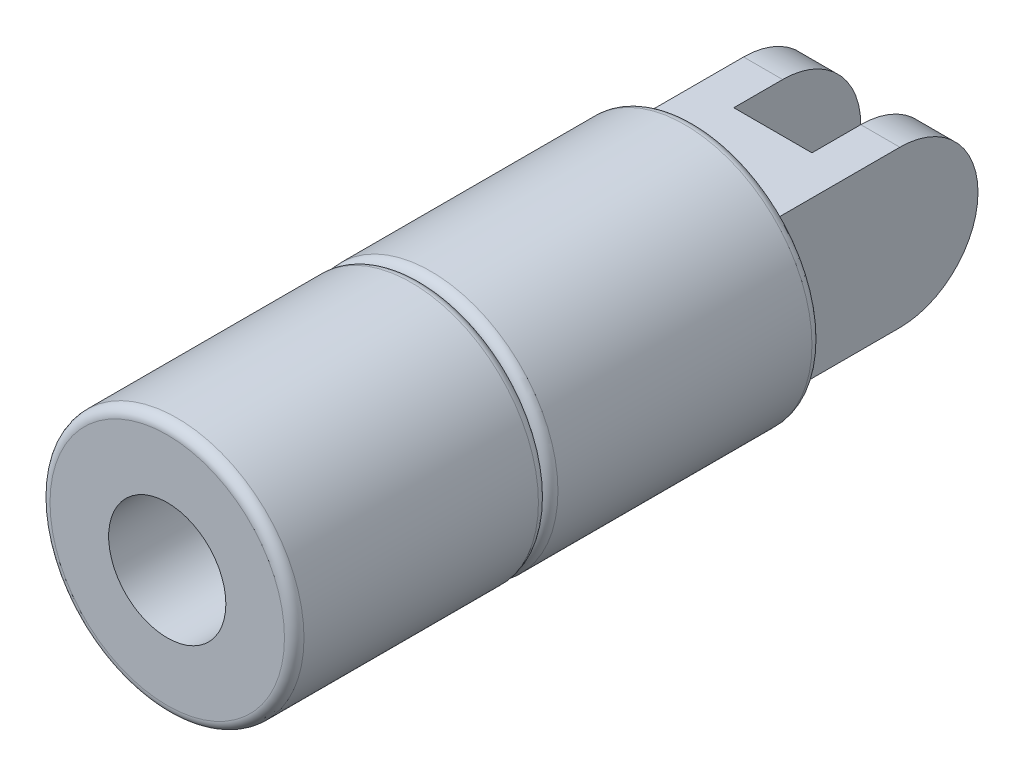
ISO-10303-21;
HEADER;
FILE_DESCRIPTION(('STEP AP214'),'2;1');
FILE_NAME('part.step','',(''),(''),'','','');
FILE_SCHEMA(('AUTOMOTIVE_DESIGN { 1 0 10303 214 1 1 1 1 }'));
ENDSEC;
DATA;
#1=APPLICATION_CONTEXT('core data for automotive mechanical design processes');
#2=APPLICATION_PROTOCOL_DEFINITION('international standard','automotive_design',2000,#1);
#3=PRODUCT_CONTEXT('',#1,'mechanical');
#4=PRODUCT('Part','Part','',(#3));
#5=PRODUCT_RELATED_PRODUCT_CATEGORY('part','',(#4));
#6=PRODUCT_DEFINITION_FORMATION('','',#4);
#7=PRODUCT_DEFINITION_CONTEXT('part definition',#1,'design');
#8=PRODUCT_DEFINITION('design','',#6,#7);
#9=PRODUCT_DEFINITION_SHAPE('','',#8);
#10=(LENGTH_UNIT() NAMED_UNIT(*) SI_UNIT(.MILLI.,.METRE.));
#11=(NAMED_UNIT(*) PLANE_ANGLE_UNIT() SI_UNIT($,.RADIAN.));
#12=(NAMED_UNIT(*) SI_UNIT($,.STERADIAN.) SOLID_ANGLE_UNIT());
#13=UNCERTAINTY_MEASURE_WITH_UNIT(LENGTH_MEASURE(1.E-05),#10,'distance_accuracy_value','');
#14=(GEOMETRIC_REPRESENTATION_CONTEXT(3) GLOBAL_UNCERTAINTY_ASSIGNED_CONTEXT((#13)) GLOBAL_UNIT_ASSIGNED_CONTEXT((#10,
#11,#12)) REPRESENTATION_CONTEXT('',''));
#15=CARTESIAN_POINT('',(0.,0.,0.));
#16=DIRECTION('',(0.,0.,1.));
#17=DIRECTION('',(1.,0.,0.));
#18=AXIS2_PLACEMENT_3D('',#15,#16,#17);
#19=CARTESIAN_POINT('',(0.,0.,-18.));
#20=DIRECTION('',(0.,0.,1.));
#21=DIRECTION('',(1.,0.,0.));
#22=AXIS2_PLACEMENT_3D('',#19,#20,#21);
#23=PLANE('',#22);
#24=DIRECTION('',(0.,-1.,0.));
#25=VECTOR('',#24,1.);
#26=CARTESIAN_POINT('',(-2.,4.,-18.));
#27=LINE('',#26,#25);
#28=CARTESIAN_POINT('',(-2.,4.,-18.));
#29=VERTEX_POINT('',#28);
#30=CARTESIAN_POINT('',(-2.,-4.,-18.));
#31=VERTEX_POINT('',#30);
#32=EDGE_CURVE('E49',#29,#31,#27,.T.);
#33=ORIENTED_EDGE('',*,*,#32,.F.);
#34=DIRECTION('',(1.,0.,0.));
#35=VECTOR('',#34,1.);
#36=CARTESIAN_POINT('',(4.,4.,-18.));
#37=LINE('',#36,#35);
#38=CARTESIAN_POINT('',(2.,4.,-18.));
#39=VERTEX_POINT('',#38);
#40=EDGE_CURVE('E153',#29,#39,#37,.T.);
#41=ORIENTED_EDGE('',*,*,#40,.T.);
#42=DIRECTION('',(0.,1.,0.));
#43=VECTOR('',#42,1.);
#44=CARTESIAN_POINT('',(2.,4.,-18.));
#45=LINE('',#44,#43);
#46=CARTESIAN_POINT('',(2.,-4.,-18.));
#47=VERTEX_POINT('',#46);
#48=EDGE_CURVE('E139',#47,#39,#45,.T.);
#49=ORIENTED_EDGE('',*,*,#48,.F.);
#50=DIRECTION('',(-1.,0.,0.));
#51=VECTOR('',#50,1.);
#52=CARTESIAN_POINT('',(4.,-4.,-18.));
#53=LINE('',#52,#51);
#54=EDGE_CURVE('E155',#47,#31,#53,.T.);
#55=ORIENTED_EDGE('',*,*,#54,.T.);
#56=EDGE_LOOP('',(#33,#41,#49,#55));
#57=FACE_BOUND('',#56,.T.);
#58=ADVANCED_FACE('F34',(#57),#23,.F.);
#59=CARTESIAN_POINT('',(0.,0.,-14.));
#60=DIRECTION('',(0.,0.,-1.));
#61=DIRECTION('',(-1.,0.,0.));
#62=AXIS2_PLACEMENT_3D('',#59,#60,#61);
#63=PLANE('',#62);
#64=CARTESIAN_POINT('',(0.,0.,-14.));
#65=DIRECTION('',(0.,0.,-1.));
#66=DIRECTION('',(-1.,0.,0.));
#67=AXIS2_PLACEMENT_3D('',#64,#65,#66);
#68=CIRCLE('',#67,6.);
#69=CARTESIAN_POINT('',(-6.,0.,-14.));
#70=VERTEX_POINT('',#69);
#71=EDGE_CURVE('E188',#70,#70,#68,.T.);
#72=ORIENTED_EDGE('',*,*,#71,.T.);
#73=EDGE_LOOP('',(#72));
#74=FACE_BOUND('',#73,.T.);
#75=DIRECTION('',(1.,0.,0.));
#76=VECTOR('',#75,1.);
#77=CARTESIAN_POINT('',(4.,4.,-14.));
#78=LINE('',#77,#76);
#79=CARTESIAN_POINT('',(-4.,4.,-14.));
#80=VERTEX_POINT('',#79);
#81=CARTESIAN_POINT('',(4.,4.,-14.));
#82=VERTEX_POINT('',#81);
#83=EDGE_CURVE('E160',#80,#82,#78,.T.);
#84=ORIENTED_EDGE('',*,*,#83,.F.);
#85=DIRECTION('',(0.,1.,0.));
#86=VECTOR('',#85,1.);
#87=CARTESIAN_POINT('',(-4.,-4.,-14.));
#88=LINE('',#87,#86);
#89=CARTESIAN_POINT('',(-4.,-4.,-14.));
#90=VERTEX_POINT('',#89);
#91=EDGE_CURVE('E115',#90,#80,#88,.T.);
#92=ORIENTED_EDGE('',*,*,#91,.F.);
#93=DIRECTION('',(-1.,0.,0.));
#94=VECTOR('',#93,1.);
#95=CARTESIAN_POINT('',(4.,-4.,-14.));
#96=LINE('',#95,#94);
#97=CARTESIAN_POINT('',(4.,-4.,-14.));
#98=VERTEX_POINT('',#97);
#99=EDGE_CURVE('E156',#98,#90,#96,.T.);
#100=ORIENTED_EDGE('',*,*,#99,.F.);
#101=DIRECTION('',(0.,-1.,0.));
#102=VECTOR('',#101,1.);
#103=CARTESIAN_POINT('',(4.,-4.,-14.));
#104=LINE('',#103,#102);
#105=EDGE_CURVE('E162',#82,#98,#104,.T.);
#106=ORIENTED_EDGE('',*,*,#105,.F.);
#107=EDGE_LOOP('',(#84,#92,#100,#106));
#108=FACE_BOUND('',#107,.T.);
#109=ADVANCED_FACE('F205',(#74,#108),#63,.T.);
#110=CARTESIAN_POINT('',(0.,0.,13.));
#111=DIRECTION('',(0.,0.,-1.));
#112=DIRECTION('',(-1.,0.,0.));
#113=AXIS2_PLACEMENT_3D('',#110,#111,#112);
#114=CYLINDRICAL_SURFACE('',#113,6.5);
#115=CARTESIAN_POINT('',(0.,0.,0.5));
#116=DIRECTION('',(0.,0.,1.));
#117=DIRECTION('',(1.,0.,0.));
#118=AXIS2_PLACEMENT_3D('',#115,#116,#117);
#119=CIRCLE('',#118,6.5);
#120=CARTESIAN_POINT('',(-6.5,0.,0.5));
#121=VERTEX_POINT('',#120);
#122=EDGE_CURVE('E179',#121,#121,#119,.T.);
#123=CARTESIAN_POINT('',(0.,0.,12.5));
#124=DIRECTION('',(0.,0.,1.));
#125=DIRECTION('',(1.,0.,0.));
#126=AXIS2_PLACEMENT_3D('',#123,#124,#125);
#127=CIRCLE('',#126,6.5);
#128=CARTESIAN_POINT('',(-6.5,0.,12.5));
#129=VERTEX_POINT('',#128);
#130=EDGE_CURVE('E174',#129,#129,#127,.F.);
#131=CARTESIAN_POINT('',(-6.5,0.,0.5));
#132=CARTESIAN_POINT('',(-6.5,0.,0.625000000000001));
#133=CARTESIAN_POINT('',(-6.5,0.,0.750000000000001));
#134=CARTESIAN_POINT('',(-6.5,0.,1.));
#135=CARTESIAN_POINT('',(-6.5,0.,1.125));
#136=CARTESIAN_POINT('',(-6.5,0.,1.375));
#137=CARTESIAN_POINT('',(-6.5,0.,1.5));
#138=CARTESIAN_POINT('',(-6.5,0.,1.75));
#139=CARTESIAN_POINT('',(-6.5,0.,1.875));
#140=CARTESIAN_POINT('',(-6.5,0.,2.125));
#141=CARTESIAN_POINT('',(-6.5,0.,2.25));
#142=CARTESIAN_POINT('',(-6.5,0.,2.5));
#143=CARTESIAN_POINT('',(-6.5,0.,2.625));
#144=CARTESIAN_POINT('',(-6.5,0.,2.875));
#145=CARTESIAN_POINT('',(-6.5,0.,3.));
#146=CARTESIAN_POINT('',(-6.5,0.,3.25));
#147=CARTESIAN_POINT('',(-6.5,0.,3.375));
#148=CARTESIAN_POINT('',(-6.5,0.,3.625));
#149=CARTESIAN_POINT('',(-6.5,0.,3.75));
#150=CARTESIAN_POINT('',(-6.5,0.,4.));
#151=CARTESIAN_POINT('',(-6.5,0.,4.125));
#152=CARTESIAN_POINT('',(-6.5,0.,4.375));
#153=CARTESIAN_POINT('',(-6.5,0.,4.5));
#154=CARTESIAN_POINT('',(-6.5,0.,4.75));
#155=CARTESIAN_POINT('',(-6.5,0.,4.875));
#156=CARTESIAN_POINT('',(-6.5,0.,5.125));
#157=CARTESIAN_POINT('',(-6.5,0.,5.25));
#158=CARTESIAN_POINT('',(-6.5,0.,5.5));
#159=CARTESIAN_POINT('',(-6.5,0.,5.625));
#160=CARTESIAN_POINT('',(-6.5,0.,5.875));
#161=CARTESIAN_POINT('',(-6.5,0.,6.));
#162=CARTESIAN_POINT('',(-6.5,0.,6.25));
#163=CARTESIAN_POINT('',(-6.5,0.,6.375));
#164=CARTESIAN_POINT('',(-6.5,0.,6.625));
#165=CARTESIAN_POINT('',(-6.5,0.,6.75));
#166=CARTESIAN_POINT('',(-6.5,0.,7.));
#167=CARTESIAN_POINT('',(-6.5,0.,7.125));
#168=CARTESIAN_POINT('',(-6.5,0.,7.375));
#169=CARTESIAN_POINT('',(-6.5,0.,7.5));
#170=CARTESIAN_POINT('',(-6.5,0.,7.75));
#171=CARTESIAN_POINT('',(-6.5,0.,7.875));
#172=CARTESIAN_POINT('',(-6.5,0.,8.125));
#173=CARTESIAN_POINT('',(-6.5,0.,8.25));
#174=CARTESIAN_POINT('',(-6.5,0.,8.5));
#175=CARTESIAN_POINT('',(-6.5,0.,8.625));
#176=CARTESIAN_POINT('',(-6.5,0.,8.875));
#177=CARTESIAN_POINT('',(-6.5,0.,9.));
#178=CARTESIAN_POINT('',(-6.5,0.,9.25));
#179=CARTESIAN_POINT('',(-6.5,0.,9.375));
#180=CARTESIAN_POINT('',(-6.5,0.,9.625));
#181=CARTESIAN_POINT('',(-6.5,0.,9.75));
#182=CARTESIAN_POINT('',(-6.5,0.,10.));
#183=CARTESIAN_POINT('',(-6.5,0.,10.125));
#184=CARTESIAN_POINT('',(-6.5,0.,10.375));
#185=CARTESIAN_POINT('',(-6.5,0.,10.5));
#186=CARTESIAN_POINT('',(-6.5,0.,10.75));
#187=CARTESIAN_POINT('',(-6.5,0.,10.875));
#188=CARTESIAN_POINT('',(-6.5,0.,11.125));
#189=CARTESIAN_POINT('',(-6.5,0.,11.25));
#190=CARTESIAN_POINT('',(-6.5,0.,11.5));
#191=CARTESIAN_POINT('',(-6.5,0.,11.625));
#192=CARTESIAN_POINT('',(-6.5,0.,11.875));
#193=CARTESIAN_POINT('',(-6.5,0.,12.));
#194=CARTESIAN_POINT('',(-6.5,0.,12.25));
#195=CARTESIAN_POINT('',(-6.5,0.,12.375));
#196=CARTESIAN_POINT('',(-6.5,0.,12.5));
#197=B_SPLINE_CURVE_WITH_KNOTS('',3,(#131,#132,#133,#134,#135,#136,#137,#138,#139,#140,#141,
#142,#143,#144,#145,#146,#147,#148,#149,#150,#151,#152,#153,#154,#155,#156,#157,#158,#159,#160,
#161,#162,#163,#164,#165,#166,#167,#168,#169,#170,#171,#172,#173,#174,#175,#176,#177,#178,#179,
#180,#181,#182,#183,#184,#185,#186,#187,#188,#189,#190,#191,#192,#193,#194,#195,#196),
.UNSPECIFIED.,.F.,.F.,(4,2,2,2,2,2,2,2,2,2,2,2,2,2,2,2,2,2,2,2,2,2,2,2,2,2,2,2,2,2,2,2,4),(0.,
0.375,0.750000000000001,1.125,1.5,1.875,2.25,2.625,3.,3.375,3.75,4.125,4.5,4.875,5.25,5.625,6.,
6.375,6.75,7.125,7.5,7.875,8.25,8.625,9.,9.375,9.75,10.125,10.5,10.875,11.25,11.625,12.),.UNSPECIFIED.);
#198=EDGE_CURVE('BSEAM210',#121,#129,#197,.T.);
#199=ORIENTED_EDGE('',*,*,#122,.T.);
#200=ORIENTED_EDGE('',*,*,#130,.T.);
#201=ORIENTED_EDGE('',*,*,#198,.T.);
#202=ORIENTED_EDGE('',*,*,#198,.F.);
#203=EDGE_LOOP('',(#199,#201,#200,#202));
#204=FACE_BOUND('',#203,.T.);
#205=ADVANCED_FACE('F210',(#204),#114,.T.);
#206=CARTESIAN_POINT('',(0.,0.,13.));
#207=DIRECTION('',(0.,0.,1.));
#208=DIRECTION('',(1.,0.,0.));
#209=AXIS2_PLACEMENT_3D('',#206,#207,#208);
#210=PLANE('',#209);
#211=CARTESIAN_POINT('',(0.,0.,13.));
#212=DIRECTION('',(0.,0.,1.));
#213=DIRECTION('',(1.,0.,0.));
#214=AXIS2_PLACEMENT_3D('',#211,#212,#213);
#215=CIRCLE('',#214,3.);
#216=CARTESIAN_POINT('',(3.,0.,13.));
#217=VERTEX_POINT('',#216);
#218=EDGE_CURVE('E117',#217,#217,#215,.T.);
#219=ORIENTED_EDGE('',*,*,#218,.F.);
#220=EDGE_LOOP('',(#219));
#221=FACE_BOUND('',#220,.T.);
#222=CARTESIAN_POINT('',(0.,0.,13.));
#223=DIRECTION('',(0.,0.,1.));
#224=DIRECTION('',(1.,0.,0.));
#225=AXIS2_PLACEMENT_3D('',#222,#223,#224);
#226=CIRCLE('',#225,6.);
#227=CARTESIAN_POINT('',(6.,0.,13.));
#228=VERTEX_POINT('',#227);
#229=EDGE_CURVE('E185',#228,#228,#226,.T.);
#230=ORIENTED_EDGE('',*,*,#229,.T.);
#231=EDGE_LOOP('',(#230));
#232=FACE_BOUND('',#231,.T.);
#233=ADVANCED_FACE('F239',(#221,#232),#210,.T.);
#234=CARTESIAN_POINT('',(0.,0.,0.5));
#235=DIRECTION('',(0.,0.,1.));
#236=DIRECTION('',(1.,0.,0.));
#237=AXIS2_PLACEMENT_3D('',#234,#235,#236);
#238=TOROIDAL_SURFACE('',#237,6.,0.5);
#239=CARTESIAN_POINT('',(0.,0.,0.));
#240=DIRECTION('',(0.,0.,1.));
#241=DIRECTION('',(1.,0.,0.));
#242=AXIS2_PLACEMENT_3D('',#239,#240,#241);
#243=CIRCLE('',#242,6.);
#244=CARTESIAN_POINT('',(6.,0.,0.));
#245=VERTEX_POINT('',#244);
#246=EDGE_CURVE('E182',#245,#245,#243,.F.);
#247=ORIENTED_EDGE('',*,*,#246,.F.);
#248=EDGE_LOOP('',(#247));
#249=FACE_BOUND('',#248,.T.);
#250=ORIENTED_EDGE('',*,*,#122,.F.);
#251=EDGE_LOOP('',(#250));
#252=FACE_BOUND('',#251,.T.);
#253=ADVANCED_FACE('F242',(#249,#252),#238,.T.);
#254=CARTESIAN_POINT('',(0.,0.,12.5));
#255=DIRECTION('',(0.,0.,1.));
#256=DIRECTION('',(1.,0.,0.));
#257=AXIS2_PLACEMENT_3D('',#254,#255,#256);
#258=TOROIDAL_SURFACE('',#257,6.,0.5);
#259=ORIENTED_EDGE('',*,*,#130,.F.);
#260=EDGE_LOOP('',(#259));
#261=FACE_BOUND('',#260,.T.);
#262=ORIENTED_EDGE('',*,*,#229,.F.);
#263=EDGE_LOOP('',(#262));
#264=FACE_BOUND('',#263,.T.);
#265=ADVANCED_FACE('F237',(#261,#264),#258,.T.);
#266=CARTESIAN_POINT('',(0.,0.,7.));
#267=DIRECTION('',(0.,0.,1.));
#268=DIRECTION('',(1.,0.,0.));
#269=AXIS2_PLACEMENT_3D('',#266,#267,#268);
#270=CYLINDRICAL_SURFACE('',#269,3.);
#271=CARTESIAN_POINT('',(0.,0.,7.));
#272=DIRECTION('',(0.,0.,1.));
#273=DIRECTION('',(1.,0.,0.));
#274=AXIS2_PLACEMENT_3D('',#271,#272,#273);
#275=CIRCLE('',#274,3.);
#276=CARTESIAN_POINT('',(3.,0.,7.));
#277=VERTEX_POINT('',#276);
#278=EDGE_CURVE('E171',#277,#277,#275,.T.);
#279=ORIENTED_EDGE('',*,*,#278,.F.);
#280=EDGE_LOOP('',(#279));
#281=FACE_BOUND('',#280,.T.);
#282=ORIENTED_EDGE('',*,*,#218,.T.);
#283=EDGE_LOOP('',(#282));
#284=FACE_BOUND('',#283,.T.);
#285=ADVANCED_FACE('F233',(#281,#284),#270,.F.);
#286=CARTESIAN_POINT('',(0.,0.,7.));
#287=DIRECTION('',(0.,0.,1.));
#288=DIRECTION('',(1.,0.,0.));
#289=AXIS2_PLACEMENT_3D('',#286,#287,#288);
#290=PLANE('',#289);
#291=ORIENTED_EDGE('',*,*,#278,.T.);
#292=EDGE_LOOP('',(#291));
#293=FACE_BOUND('',#292,.T.);
#294=ADVANCED_FACE('F229',(#293),#290,.T.);
#295=CARTESIAN_POINT('',(0.,0.,-14.));
#296=DIRECTION('',(0.,0.,1.));
#297=DIRECTION('',(1.,0.,0.));
#298=AXIS2_PLACEMENT_3D('',#295,#296,#297);
#299=CYLINDRICAL_SURFACE('',#298,6.5);
#300=CARTESIAN_POINT('',(0.,0.,-13.5));
#301=DIRECTION('',(0.,0.,-1.));
#302=DIRECTION('',(-1.,0.,0.));
#303=AXIS2_PLACEMENT_3D('',#300,#301,#302);
#304=CIRCLE('',#303,6.5);
#305=CARTESIAN_POINT('',(-6.5,0.,-13.5));
#306=VERTEX_POINT('',#305);
#307=EDGE_CURVE('E11',#306,#306,#304,.F.);
#308=ORIENTED_EDGE('',*,*,#307,.T.);
#309=EDGE_LOOP('',(#308));
#310=FACE_BOUND('',#309,.T.);
#311=CARTESIAN_POINT('',(0.,0.,-0.5));
#312=DIRECTION('',(0.,0.,-1.));
#313=DIRECTION('',(-1.,0.,0.));
#314=AXIS2_PLACEMENT_3D('',#311,#312,#313);
#315=CIRCLE('',#314,6.5);
#316=CARTESIAN_POINT('',(-6.5,0.,-0.5));
#317=VERTEX_POINT('',#316);
#318=EDGE_CURVE('E42',#317,#317,#315,.T.);
#319=ORIENTED_EDGE('',*,*,#318,.T.);
#320=EDGE_LOOP('',(#319));
#321=FACE_BOUND('',#320,.T.);
#322=ADVANCED_FACE('F193',(#310,#321),#299,.T.);
#323=CARTESIAN_POINT('',(0.,0.,-13.5));
#324=DIRECTION('',(0.,0.,-1.));
#325=DIRECTION('',(-1.,0.,0.));
#326=AXIS2_PLACEMENT_3D('',#323,#324,#325);
#327=TOROIDAL_SURFACE('',#326,6.,0.5);
#328=ORIENTED_EDGE('',*,*,#307,.F.);
#329=EDGE_LOOP('',(#328));
#330=FACE_BOUND('',#329,.T.);
#331=ORIENTED_EDGE('',*,*,#71,.F.);
#332=EDGE_LOOP('',(#331));
#333=FACE_BOUND('',#332,.T.);
#334=ADVANCED_FACE('F196',(#330,#333),#327,.T.);
#335=CARTESIAN_POINT('',(0.,0.,-0.5));
#336=DIRECTION('',(0.,0.,-1.));
#337=DIRECTION('',(-1.,0.,0.));
#338=AXIS2_PLACEMENT_3D('',#335,#336,#337);
#339=TOROIDAL_SURFACE('',#338,6.,0.5);
#340=ORIENTED_EDGE('',*,*,#246,.T.);
#341=EDGE_LOOP('',(#340));
#342=FACE_BOUND('',#341,.T.);
#343=ORIENTED_EDGE('',*,*,#318,.F.);
#344=EDGE_LOOP('',(#343));
#345=FACE_BOUND('',#344,.T.);
#346=ADVANCED_FACE('F36',(#342,#345),#339,.T.);
#347=CARTESIAN_POINT('',(-4.,-4.,-18.));
#348=DIRECTION('',(1.,0.,0.));
#349=DIRECTION('',(0.,0.,-1.));
#350=AXIS2_PLACEMENT_3D('',#347,#348,#349);
#351=PLANE('',#350);
#352=DIRECTION('',(0.,0.,1.));
#353=VECTOR('',#352,1.);
#354=CARTESIAN_POINT('',(-4.,4.,-18.));
#355=LINE('',#354,#353);
#356=CARTESIAN_POINT('',(-4.,4.,-20.5));
#357=VERTEX_POINT('',#356);
#358=EDGE_CURVE('E100',#357,#80,#355,.T.);
#359=ORIENTED_EDGE('',*,*,#358,.F.);
#360=CARTESIAN_POINT('',(-4.,0.,-20.5));
#361=DIRECTION('',(1.,0.,0.));
#362=DIRECTION('',(0.,0.,-1.));
#363=AXIS2_PLACEMENT_3D('',#360,#361,#362);
#364=CIRCLE('',#363,4.);
#365=CARTESIAN_POINT('',(-4.,-4.,-20.5));
#366=VERTEX_POINT('',#365);
#367=EDGE_CURVE('E113',#366,#357,#364,.T.);
#368=ORIENTED_EDGE('',*,*,#367,.F.);
#369=DIRECTION('',(0.,0.,1.));
#370=VECTOR('',#369,1.);
#371=CARTESIAN_POINT('',(-4.,-4.,-18.));
#372=LINE('',#371,#370);
#373=EDGE_CURVE('E158',#366,#90,#372,.T.);
#374=ORIENTED_EDGE('',*,*,#373,.T.);
#375=ORIENTED_EDGE('',*,*,#91,.T.);
#376=EDGE_LOOP('',(#359,#368,#374,#375));
#377=FACE_BOUND('',#376,.T.);
#378=ADVANCED_FACE('F111',(#377),#351,.F.);
#379=CARTESIAN_POINT('',(4.,4.,-18.));
#380=DIRECTION('',(0.,-1.,0.));
#381=DIRECTION('',(0.,0.,-1.));
#382=AXIS2_PLACEMENT_3D('',#379,#380,#381);
#383=PLANE('',#382);
#384=ORIENTED_EDGE('',*,*,#83,.T.);
#385=DIRECTION('',(0.,0.,1.));
#386=VECTOR('',#385,1.);
#387=CARTESIAN_POINT('',(4.,4.,-18.));
#388=LINE('',#387,#386);
#389=CARTESIAN_POINT('',(4.,4.,-20.5));
#390=VERTEX_POINT('',#389);
#391=EDGE_CURVE('E118',#390,#82,#388,.T.);
#392=ORIENTED_EDGE('',*,*,#391,.F.);
#393=DIRECTION('',(1.,0.,0.));
#394=VECTOR('',#393,1.);
#395=CARTESIAN_POINT('',(4.,4.,-20.5));
#396=LINE('',#395,#394);
#397=CARTESIAN_POINT('',(2.,4.,-20.5));
#398=VERTEX_POINT('',#397);
#399=EDGE_CURVE('E143',#398,#390,#396,.T.);
#400=ORIENTED_EDGE('',*,*,#399,.F.);
#401=DIRECTION('',(0.,0.,1.));
#402=VECTOR('',#401,1.);
#403=CARTESIAN_POINT('',(2.,4.,-20.5));
#404=LINE('',#403,#402);
#405=EDGE_CURVE('E146',#398,#39,#404,.T.);
#406=ORIENTED_EDGE('',*,*,#405,.T.);
#407=ORIENTED_EDGE('',*,*,#40,.F.);
#408=DIRECTION('',(0.,0.,1.));
#409=VECTOR('',#408,1.);
#410=CARTESIAN_POINT('',(-2.,4.,-20.5));
#411=LINE('',#410,#409);
#412=CARTESIAN_POINT('',(-2.,4.,-20.5));
#413=VERTEX_POINT('',#412);
#414=EDGE_CURVE('E102',#413,#29,#411,.T.);
#415=ORIENTED_EDGE('',*,*,#414,.F.);
#416=DIRECTION('',(1.,0.,0.));
#417=VECTOR('',#416,1.);
#418=CARTESIAN_POINT('',(-4.,4.,-20.5));
#419=LINE('',#418,#417);
#420=EDGE_CURVE('E97',#357,#413,#419,.T.);
#421=ORIENTED_EDGE('',*,*,#420,.F.);
#422=ORIENTED_EDGE('',*,*,#358,.T.);
#423=EDGE_LOOP('',(#384,#392,#400,#406,#407,#415,#421,#422));
#424=FACE_BOUND('',#423,.T.);
#425=ADVANCED_FACE('F99',(#424),#383,.F.);
#426=CARTESIAN_POINT('',(4.,-4.,-18.));
#427=DIRECTION('',(-1.,0.,0.));
#428=DIRECTION('',(0.,0.,1.));
#429=AXIS2_PLACEMENT_3D('',#426,#427,#428);
#430=PLANE('',#429);
#431=DIRECTION('',(0.,0.,1.));
#432=VECTOR('',#431,1.);
#433=CARTESIAN_POINT('',(4.,-4.,-18.));
#434=LINE('',#433,#432);
#435=CARTESIAN_POINT('',(4.,-4.,-20.5));
#436=VERTEX_POINT('',#435);
#437=EDGE_CURVE('E167',#436,#98,#434,.T.);
#438=ORIENTED_EDGE('',*,*,#437,.F.);
#439=CARTESIAN_POINT('',(4.,0.,-20.5));
#440=DIRECTION('',(1.,0.,0.));
#441=DIRECTION('',(0.,0.,-1.));
#442=AXIS2_PLACEMENT_3D('',#439,#440,#441);
#443=CIRCLE('',#442,4.);
#444=EDGE_CURVE('E125',#436,#390,#443,.T.);
#445=ORIENTED_EDGE('',*,*,#444,.T.);
#446=ORIENTED_EDGE('',*,*,#391,.T.);
#447=ORIENTED_EDGE('',*,*,#105,.T.);
#448=EDGE_LOOP('',(#438,#445,#446,#447));
#449=FACE_BOUND('',#448,.T.);
#450=ADVANCED_FACE('F220',(#449),#430,.F.);
#451=CARTESIAN_POINT('',(4.,-4.,-18.));
#452=DIRECTION('',(0.,1.,0.));
#453=DIRECTION('',(0.,0.,1.));
#454=AXIS2_PLACEMENT_3D('',#451,#452,#453);
#455=PLANE('',#454);
#456=ORIENTED_EDGE('',*,*,#99,.T.);
#457=ORIENTED_EDGE('',*,*,#373,.F.);
#458=DIRECTION('',(-1.,0.,0.));
#459=VECTOR('',#458,1.);
#460=CARTESIAN_POINT('',(-4.,-4.,-20.5));
#461=LINE('',#460,#459);
#462=CARTESIAN_POINT('',(-2.,-4.,-20.5));
#463=VERTEX_POINT('',#462);
#464=EDGE_CURVE('E107',#463,#366,#461,.T.);
#465=ORIENTED_EDGE('',*,*,#464,.F.);
#466=DIRECTION('',(0.,0.,1.));
#467=VECTOR('',#466,1.);
#468=CARTESIAN_POINT('',(-2.,-4.,-20.5));
#469=LINE('',#468,#467);
#470=EDGE_CURVE('E134',#463,#31,#469,.T.);
#471=ORIENTED_EDGE('',*,*,#470,.T.);
#472=ORIENTED_EDGE('',*,*,#54,.F.);
#473=DIRECTION('',(0.,0.,1.));
#474=VECTOR('',#473,1.);
#475=CARTESIAN_POINT('',(2.,-4.,-20.5));
#476=LINE('',#475,#474);
#477=CARTESIAN_POINT('',(2.,-4.,-20.5));
#478=VERTEX_POINT('',#477);
#479=EDGE_CURVE('E150',#478,#47,#476,.T.);
#480=ORIENTED_EDGE('',*,*,#479,.F.);
#481=DIRECTION('',(-1.,0.,0.));
#482=VECTOR('',#481,1.);
#483=CARTESIAN_POINT('',(4.,-4.,-20.5));
#484=LINE('',#483,#482);
#485=EDGE_CURVE('E140',#436,#478,#484,.T.);
#486=ORIENTED_EDGE('',*,*,#485,.F.);
#487=ORIENTED_EDGE('',*,*,#437,.T.);
#488=EDGE_LOOP('',(#456,#457,#465,#471,#472,#480,#486,#487));
#489=FACE_BOUND('',#488,.T.);
#490=ADVANCED_FACE('F217',(#489),#455,.F.);
#491=CARTESIAN_POINT('',(2.,4.,-20.5));
#492=DIRECTION('',(1.,0.,0.));
#493=DIRECTION('',(0.,1.,0.));
#494=AXIS2_PLACEMENT_3D('',#491,#492,#493);
#495=PLANE('',#494);
#496=ORIENTED_EDGE('',*,*,#48,.T.);
#497=ORIENTED_EDGE('',*,*,#405,.F.);
#498=CARTESIAN_POINT('',(2.,0.,-20.5));
#499=DIRECTION('',(1.,0.,0.));
#500=DIRECTION('',(0.,0.,-1.));
#501=AXIS2_PLACEMENT_3D('',#498,#499,#500);
#502=CIRCLE('',#501,4.);
#503=EDGE_CURVE('E128',#478,#398,#502,.T.);
#504=ORIENTED_EDGE('',*,*,#503,.F.);
#505=ORIENTED_EDGE('',*,*,#479,.T.);
#506=EDGE_LOOP('',(#496,#497,#504,#505));
#507=FACE_BOUND('',#506,.T.);
#508=ADVANCED_FACE('F215',(#507),#495,.F.);
#509=CARTESIAN_POINT('',(-2.,4.,-20.5));
#510=DIRECTION('',(-1.,0.,0.));
#511=DIRECTION('',(0.,-1.,0.));
#512=AXIS2_PLACEMENT_3D('',#509,#510,#511);
#513=PLANE('',#512);
#514=ORIENTED_EDGE('',*,*,#470,.F.);
#515=CARTESIAN_POINT('',(-2.,0.,-20.5));
#516=DIRECTION('',(1.,0.,0.));
#517=DIRECTION('',(0.,0.,-1.));
#518=AXIS2_PLACEMENT_3D('',#515,#516,#517);
#519=CIRCLE('',#518,4.);
#520=EDGE_CURVE('E123',#463,#413,#519,.T.);
#521=ORIENTED_EDGE('',*,*,#520,.T.);
#522=ORIENTED_EDGE('',*,*,#414,.T.);
#523=ORIENTED_EDGE('',*,*,#32,.T.);
#524=EDGE_LOOP('',(#514,#521,#522,#523));
#525=FACE_BOUND('',#524,.T.);
#526=ADVANCED_FACE('F306',(#525),#513,.F.);
#527=CARTESIAN_POINT('',(2.,0.,-20.5));
#528=DIRECTION('',(1.,0.,0.));
#529=DIRECTION('',(0.,0.,-1.));
#530=AXIS2_PLACEMENT_3D('',#527,#528,#529);
#531=CYLINDRICAL_SURFACE('',#530,4.);
#532=ORIENTED_EDGE('',*,*,#503,.T.);
#533=ORIENTED_EDGE('',*,*,#399,.T.);
#534=ORIENTED_EDGE('',*,*,#444,.F.);
#535=ORIENTED_EDGE('',*,*,#485,.T.);
#536=EDGE_LOOP('',(#532,#533,#534,#535));
#537=FACE_BOUND('',#536,.T.);
#538=ADVANCED_FACE('F314',(#537),#531,.T.);
#539=CARTESIAN_POINT('',(-2.,0.,-20.5));
#540=DIRECTION('',(-1.,0.,0.));
#541=DIRECTION('',(0.,0.,1.));
#542=AXIS2_PLACEMENT_3D('',#539,#540,#541);
#543=CYLINDRICAL_SURFACE('',#542,4.);
#544=ORIENTED_EDGE('',*,*,#367,.T.);
#545=ORIENTED_EDGE('',*,*,#420,.T.);
#546=ORIENTED_EDGE('',*,*,#520,.F.);
#547=ORIENTED_EDGE('',*,*,#464,.T.);
#548=EDGE_LOOP('',(#544,#545,#546,#547));
#549=FACE_BOUND('',#548,.T.);
#550=ADVANCED_FACE('F121',(#549),#543,.T.);
#551=CLOSED_SHELL('',(#58,#109,#205,#233,#253,#265,#285,#294,#322,#334,#346,#378,#425,#450,#490,
#508,#526,#538,#550));
#552=MANIFOLD_SOLID_BREP('B2',#551);
#553=ADVANCED_BREP_SHAPE_REPRESENTATION('',(#18,#552),#14);
#554=SHAPE_DEFINITION_REPRESENTATION(#9,#553);
ENDSEC;
END-ISO-10303-21;
